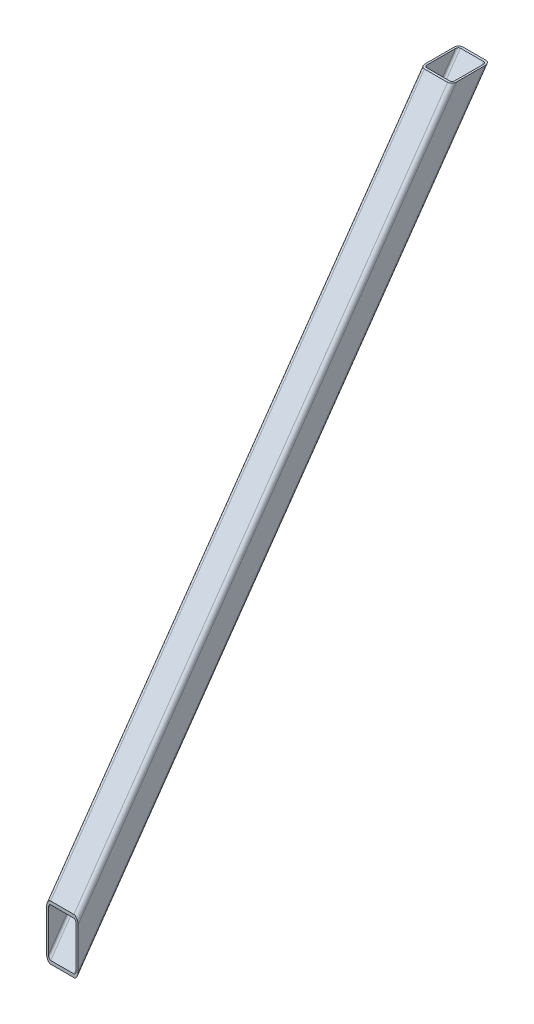
ISO-10303-21;
HEADER;
FILE_DESCRIPTION(('STEP AP214'),'2;1');
FILE_NAME('part.step','',(''),(''),'','','');
FILE_SCHEMA(('AUTOMOTIVE_DESIGN { 1 0 10303 214 1 1 1 1 }'));
ENDSEC;
DATA;
#1=APPLICATION_CONTEXT('core data for automotive mechanical design processes');
#2=APPLICATION_PROTOCOL_DEFINITION('international standard','automotive_design',2000,#1);
#3=PRODUCT_CONTEXT('',#1,'mechanical');
#4=PRODUCT('Part','Part','',(#3));
#5=PRODUCT_RELATED_PRODUCT_CATEGORY('part','',(#4));
#6=PRODUCT_DEFINITION_FORMATION('','',#4);
#7=PRODUCT_DEFINITION_CONTEXT('part definition',#1,'design');
#8=PRODUCT_DEFINITION('design','',#6,#7);
#9=PRODUCT_DEFINITION_SHAPE('','',#8);
#10=(LENGTH_UNIT() NAMED_UNIT(*) SI_UNIT(.MILLI.,.METRE.));
#11=(NAMED_UNIT(*) PLANE_ANGLE_UNIT() SI_UNIT($,.RADIAN.));
#12=(NAMED_UNIT(*) SI_UNIT($,.STERADIAN.) SOLID_ANGLE_UNIT());
#13=UNCERTAINTY_MEASURE_WITH_UNIT(LENGTH_MEASURE(1.E-05),#10,'distance_accuracy_value','');
#14=(GEOMETRIC_REPRESENTATION_CONTEXT(3) GLOBAL_UNCERTAINTY_ASSIGNED_CONTEXT((#13)) GLOBAL_UNIT_ASSIGNED_CONTEXT((#10,
#11,#12)) REPRESENTATION_CONTEXT('',''));
#15=CARTESIAN_POINT('',(0.,0.,0.));
#16=DIRECTION('',(0.,0.,1.));
#17=DIRECTION('',(1.,0.,0.));
#18=AXIS2_PLACEMENT_3D('',#15,#16,#17);
#19=CARTESIAN_POINT('',(1.11022302462516E-13,285.,-635.5));
#20=DIRECTION('',(0.,-1.,0.));
#21=DIRECTION('',(0.,0.,-1.));
#22=AXIS2_PLACEMENT_3D('',#19,#20,#21);
#23=PLANE('',#22);
#24=DIRECTION('',(0.,0.,1.));
#25=VECTOR('',#24,1.);
#26=CARTESIAN_POINT('',(22.,285.,15.1543128193461));
#27=LINE('',#26,#25);
#28=CARTESIAN_POINT('',(22.,285.,-653.883084662829));
#29=VERTEX_POINT('',#28);
#30=CARTESIAN_POINT('',(22.,285.,-608.714424878655));
#31=VERTEX_POINT('',#30);
#32=EDGE_CURVE('E185',#29,#31,#27,.T.);
#33=ORIENTED_EDGE('',*,*,#32,.T.);
#34=CARTESIAN_POINT('',(18.5,285.,-608.714424878655));
#35=DIRECTION('',(0.,-1.,0.));
#36=DIRECTION('',(0.,0.,-1.));
#37=AXIS2_PLACEMENT_3D('',#34,#35,#36);
#38=ELLIPSE('',#37,4.27271106066511,3.50000000000001);
#39=CARTESIAN_POINT('',(18.5,285.,-604.44171381799));
#40=VERTEX_POINT('',#39);
#41=EDGE_CURVE('E284',#31,#40,#38,.T.);
#42=ORIENTED_EDGE('',*,*,#41,.T.);
#43=DIRECTION('',(-1.,0.,0.));
#44=VECTOR('',#43,1.);
#45=CARTESIAN_POINT('',(18.5,285.,-604.44171381799));
#46=LINE('',#45,#44);
#47=CARTESIAN_POINT('',(-18.5,285.,-604.44171381799));
#48=VERTEX_POINT('',#47);
#49=EDGE_CURVE('E280',#40,#48,#46,.T.);
#50=ORIENTED_EDGE('',*,*,#49,.T.);
#51=CARTESIAN_POINT('',(-18.5,285.,-608.714424878655));
#52=DIRECTION('',(0.,-1.,0.));
#53=DIRECTION('',(0.,0.,-1.));
#54=AXIS2_PLACEMENT_3D('',#51,#52,#53);
#55=ELLIPSE('',#54,4.27271106066511,3.50000000000001);
#56=CARTESIAN_POINT('',(-22.,285.,-608.714424878655));
#57=VERTEX_POINT('',#56);
#58=EDGE_CURVE('E281',#48,#57,#55,.T.);
#59=ORIENTED_EDGE('',*,*,#58,.T.);
#60=DIRECTION('',(0.,0.,-1.));
#61=VECTOR('',#60,1.);
#62=CARTESIAN_POINT('',(-22.0000000000001,285.,-15.1543128193465));
#63=LINE('',#62,#61);
#64=CARTESIAN_POINT('',(-22.,285.,-653.883084662829));
#65=VERTEX_POINT('',#64);
#66=EDGE_CURVE('E187',#57,#65,#63,.T.);
#67=ORIENTED_EDGE('',*,*,#66,.T.);
#68=CARTESIAN_POINT('',(-18.5,285.,-653.883084662829));
#69=DIRECTION('',(0.,-1.,0.));
#70=DIRECTION('',(0.,0.,-1.));
#71=AXIS2_PLACEMENT_3D('',#68,#69,#70);
#72=ELLIPSE('',#71,4.27271106066511,3.50000000000001);
#73=CARTESIAN_POINT('',(-18.5,285.,-658.155795723494));
#74=VERTEX_POINT('',#73);
#75=EDGE_CURVE('E191',#65,#74,#72,.T.);
#76=ORIENTED_EDGE('',*,*,#75,.T.);
#77=DIRECTION('',(1.,0.,0.));
#78=VECTOR('',#77,1.);
#79=CARTESIAN_POINT('',(18.5,285.,-658.155795723494));
#80=LINE('',#79,#78);
#81=CARTESIAN_POINT('',(18.5,285.,-658.155795723494));
#82=VERTEX_POINT('',#81);
#83=EDGE_CURVE('E78',#74,#82,#80,.T.);
#84=ORIENTED_EDGE('',*,*,#83,.T.);
#85=CARTESIAN_POINT('',(18.5,285.,-653.883084662829));
#86=DIRECTION('',(0.,-1.,0.));
#87=DIRECTION('',(0.,0.,-1.));
#88=AXIS2_PLACEMENT_3D('',#85,#86,#87);
#89=ELLIPSE('',#88,4.27271106066511,3.50000000000001);
#90=EDGE_CURVE('E13',#82,#29,#89,.T.);
#91=ORIENTED_EDGE('',*,*,#90,.T.);
#92=EDGE_LOOP('',(#33,#42,#50,#59,#67,#76,#84,#91));
#93=FACE_BOUND('',#92,.T.);
#94=CARTESIAN_POINT('',(18.5000000000001,285.,-608.714424878655));
#95=DIRECTION('',(0.,-1.,0.));
#96=DIRECTION('',(0.,0.,-1.));
#97=AXIS2_PLACEMENT_3D('',#94,#95,#96);
#98=ELLIPSE('',#97,7.93503482694948,6.50000000000001);
#99=CARTESIAN_POINT('',(25.0000000000001,285.,-608.714424878655));
#100=VERTEX_POINT('',#99);
#101=CARTESIAN_POINT('',(18.5,285.,-600.779390051705));
#102=VERTEX_POINT('',#101);
#103=EDGE_CURVE('E260',#100,#102,#98,.T.);
#104=ORIENTED_EDGE('',*,*,#103,.F.);
#105=DIRECTION('',(0.,0.,1.));
#106=VECTOR('',#105,1.);
#107=CARTESIAN_POINT('',(25.0000000000001,285.,15.1543128193461));
#108=LINE('',#107,#106);
#109=CARTESIAN_POINT('',(25.0000000000001,285.,-653.883084662829));
#110=VERTEX_POINT('',#109);
#111=EDGE_CURVE('E203',#110,#100,#108,.T.);
#112=ORIENTED_EDGE('',*,*,#111,.F.);
#113=CARTESIAN_POINT('',(18.5000000000001,285.,-653.883084662829));
#114=DIRECTION('',(0.,-1.,0.));
#115=DIRECTION('',(0.,0.,-1.));
#116=AXIS2_PLACEMENT_3D('',#113,#114,#115);
#117=ELLIPSE('',#116,7.93503482694948,6.50000000000001);
#118=CARTESIAN_POINT('',(18.5,285.,-661.818119489778));
#119=VERTEX_POINT('',#118);
#120=EDGE_CURVE('E201',#119,#110,#117,.T.);
#121=ORIENTED_EDGE('',*,*,#120,.F.);
#122=DIRECTION('',(1.,0.,0.));
#123=VECTOR('',#122,1.);
#124=CARTESIAN_POINT('',(18.5,285.,-661.818119489778));
#125=LINE('',#124,#123);
#126=CARTESIAN_POINT('',(-18.4999999999999,285.,-661.818119489778));
#127=VERTEX_POINT('',#126);
#128=EDGE_CURVE('E197',#127,#119,#125,.T.);
#129=ORIENTED_EDGE('',*,*,#128,.F.);
#130=CARTESIAN_POINT('',(-18.5,285.,-653.883084662829));
#131=DIRECTION('',(0.,-1.,0.));
#132=DIRECTION('',(0.,0.,-1.));
#133=AXIS2_PLACEMENT_3D('',#130,#131,#132);
#134=ELLIPSE('',#133,7.93503482694948,6.50000000000001);
#135=CARTESIAN_POINT('',(-25.,285.,-653.883084662829));
#136=VERTEX_POINT('',#135);
#137=EDGE_CURVE('E195',#136,#127,#134,.T.);
#138=ORIENTED_EDGE('',*,*,#137,.F.);
#139=DIRECTION('',(0.,0.,-1.));
#140=VECTOR('',#139,1.);
#141=CARTESIAN_POINT('',(-25.,285.,-15.1543128193465));
#142=LINE('',#141,#140);
#143=CARTESIAN_POINT('',(-25.,285.,-608.714424878655));
#144=VERTEX_POINT('',#143);
#145=EDGE_CURVE('E188',#144,#136,#142,.T.);
#146=ORIENTED_EDGE('',*,*,#145,.F.);
#147=CARTESIAN_POINT('',(-18.4999999999999,285.,-608.714424878655));
#148=DIRECTION('',(0.,-1.,0.));
#149=DIRECTION('',(0.,0.,-1.));
#150=AXIS2_PLACEMENT_3D('',#147,#148,#149);
#151=ELLIPSE('',#150,7.93503482694948,6.50000000000001);
#152=CARTESIAN_POINT('',(-18.4999999999999,285.,-600.779390051705));
#153=VERTEX_POINT('',#152);
#154=EDGE_CURVE('E277',#153,#144,#151,.T.);
#155=ORIENTED_EDGE('',*,*,#154,.F.);
#156=DIRECTION('',(-1.,0.,0.));
#157=VECTOR('',#156,1.);
#158=CARTESIAN_POINT('',(18.5,285.,-600.779390051705));
#159=LINE('',#158,#157);
#160=EDGE_CURVE('E267',#102,#153,#159,.T.);
#161=ORIENTED_EDGE('',*,*,#160,.F.);
#162=EDGE_LOOP('',(#104,#112,#121,#129,#138,#146,#155,#161));
#163=FACE_BOUND('',#162,.T.);
#164=ADVANCED_FACE('F68',(#93,#163),#23,.F.);
#165=CARTESIAN_POINT('',(-25.,-627.199222357105,-15.1543128193465));
#166=DIRECTION('',(1.,0.,0.));
#167=DIRECTION('',(0.,0.,-1.));
#168=AXIS2_PLACEMENT_3D('',#165,#166,#167);
#169=PLANE('',#168);
#170=DIRECTION('',(0.,0.819152044288991,-0.573576436351047));
#171=VECTOR('',#170,1.);
#172=CARTESIAN_POINT('',(-25.,-627.199222357105,-15.1543128193465));
#173=LINE('',#172,#171);
#174=CARTESIAN_POINT('',(-25.,-640.272935963149,-6.));
#175=VERTEX_POINT('',#174);
#176=EDGE_CURVE('E87',#175,#136,#173,.T.);
#177=ORIENTED_EDGE('',*,*,#176,.F.);
#178=DIRECTION('',(0.,1.,0.));
#179=VECTOR('',#178,1.);
#180=CARTESIAN_POINT('',(-25.,-627.199222357105,-6.));
#181=LINE('',#180,#179);
#182=CARTESIAN_POINT('',(-25.,-575.765404525168,-6.));
#183=VERTEX_POINT('',#182);
#184=EDGE_CURVE('E312',#175,#183,#181,.T.);
#185=ORIENTED_EDGE('',*,*,#184,.T.);
#186=DIRECTION('',(0.,0.819152044288991,-0.573576436351047));
#187=VECTOR('',#186,1.);
#188=CARTESIAN_POINT('',(-25.,-605.976894212117,15.1543128193461));
#189=LINE('',#188,#187);
#190=EDGE_CURVE('E296',#183,#144,#189,.T.);
#191=ORIENTED_EDGE('',*,*,#190,.T.);
#192=ORIENTED_EDGE('',*,*,#145,.T.);
#193=EDGE_LOOP('',(#177,#185,#191,#192));
#194=FACE_BOUND('',#193,.T.);
#195=ADVANCED_FACE('F224',(#194),#169,.F.);
#196=CARTESIAN_POINT('',(-18.5,-627.199222357105,-15.1543128193465));
#197=DIRECTION('',(0.,0.819152044288991,-0.573576436351047));
#198=DIRECTION('',(0.,0.573576436351047,0.819152044288991));
#199=AXIS2_PLACEMENT_3D('',#196,#197,#198);
#200=CYLINDRICAL_SURFACE('',#199,6.50000000000001);
#201=DIRECTION('',(0.,0.819152044288991,-0.573576436351047));
#202=VECTOR('',#201,1.);
#203=CARTESIAN_POINT('',(-18.4999999999999,-630.927469193387,-20.478801107225));
#204=LINE('',#203,#202);
#205=CARTESIAN_POINT('',(-18.4999999999999,-651.605340134686,-6.));
#206=VERTEX_POINT('',#205);
#207=EDGE_CURVE('E200',#206,#127,#204,.T.);
#208=ORIENTED_EDGE('',*,*,#207,.F.);
#209=CARTESIAN_POINT('',(-18.5,-640.272935963149,-6.));
#210=DIRECTION('',(0.,0.,-1.));
#211=DIRECTION('',(0.,1.,0.));
#212=AXIS2_PLACEMENT_3D('',#209,#210,#211);
#213=ELLIPSE('',#212,11.3324041715371,6.50000000000001);
#214=EDGE_CURVE('E314',#206,#175,#213,.T.);
#215=ORIENTED_EDGE('',*,*,#214,.T.);
#216=ORIENTED_EDGE('',*,*,#176,.T.);
#217=ORIENTED_EDGE('',*,*,#137,.T.);
#218=EDGE_LOOP('',(#208,#215,#216,#217));
#219=FACE_BOUND('',#218,.T.);
#220=ADVANCED_FACE('F229',(#219),#200,.T.);
#221=CARTESIAN_POINT('',(18.5,-630.927469193387,-20.478801107225));
#222=DIRECTION('',(0.,0.573576436351047,0.819152044288991));
#223=DIRECTION('',(0.,-0.819152044288991,0.573576436351047));
#224=AXIS2_PLACEMENT_3D('',#221,#222,#223);
#225=PLANE('',#224);
#226=DIRECTION('',(0.,0.819152044288991,-0.573576436351047));
#227=VECTOR('',#226,1.);
#228=CARTESIAN_POINT('',(18.5,-630.927469193387,-20.478801107225));
#229=LINE('',#228,#227);
#230=CARTESIAN_POINT('',(18.5,-651.605340134686,-6.));
#231=VERTEX_POINT('',#230);
#232=EDGE_CURVE('E100',#231,#119,#229,.T.);
#233=ORIENTED_EDGE('',*,*,#232,.F.);
#234=DIRECTION('',(-1.,0.,0.));
#235=VECTOR('',#234,1.);
#236=CARTESIAN_POINT('',(18.5,-651.605340134686,-6.));
#237=LINE('',#236,#235);
#238=EDGE_CURVE('E316',#231,#206,#237,.T.);
#239=ORIENTED_EDGE('',*,*,#238,.T.);
#240=ORIENTED_EDGE('',*,*,#207,.T.);
#241=ORIENTED_EDGE('',*,*,#128,.T.);
#242=EDGE_LOOP('',(#233,#239,#240,#241));
#243=FACE_BOUND('',#242,.T.);
#244=ADVANCED_FACE('F236',(#243),#225,.F.);
#245=CARTESIAN_POINT('',(18.5000000000001,-627.199222357105,-15.1543128193465));
#246=DIRECTION('',(0.,0.819152044288991,-0.573576436351047));
#247=DIRECTION('',(0.,0.573576436351047,0.819152044288991));
#248=AXIS2_PLACEMENT_3D('',#245,#246,#247);
#249=CYLINDRICAL_SURFACE('',#248,6.50000000000001);
#250=DIRECTION('',(0.,0.819152044288991,-0.573576436351047));
#251=VECTOR('',#250,1.);
#252=CARTESIAN_POINT('',(25.0000000000001,-627.199222357105,-15.1543128193465));
#253=LINE('',#252,#251);
#254=CARTESIAN_POINT('',(25.0000000000001,-640.272935963149,-6.));
#255=VERTEX_POINT('',#254);
#256=EDGE_CURVE('E108',#255,#110,#253,.T.);
#257=ORIENTED_EDGE('',*,*,#256,.F.);
#258=CARTESIAN_POINT('',(18.5000000000001,-640.272935963149,-6.));
#259=DIRECTION('',(0.,0.,-1.));
#260=DIRECTION('',(0.,1.,0.));
#261=AXIS2_PLACEMENT_3D('',#258,#259,#260);
#262=ELLIPSE('',#261,11.3324041715371,6.50000000000001);
#263=EDGE_CURVE('E319',#255,#231,#262,.T.);
#264=ORIENTED_EDGE('',*,*,#263,.T.);
#265=ORIENTED_EDGE('',*,*,#232,.T.);
#266=ORIENTED_EDGE('',*,*,#120,.T.);
#267=EDGE_LOOP('',(#257,#264,#265,#266));
#268=FACE_BOUND('',#267,.T.);
#269=ADVANCED_FACE('F239',(#268),#249,.T.);
#270=CARTESIAN_POINT('',(25.0000000000001,-605.976894212117,15.1543128193461));
#271=DIRECTION('',(-1.,0.,0.));
#272=DIRECTION('',(0.,0.,1.));
#273=AXIS2_PLACEMENT_3D('',#270,#271,#272);
#274=PLANE('',#273);
#275=ORIENTED_EDGE('',*,*,#111,.T.);
#276=DIRECTION('',(0.,0.819152044288991,-0.573576436351047));
#277=VECTOR('',#276,1.);
#278=CARTESIAN_POINT('',(25.0000000000001,-605.976894212117,15.1543128193461));
#279=LINE('',#278,#277);
#280=CARTESIAN_POINT('',(25.0000000000001,-575.765404525168,-6.));
#281=VERTEX_POINT('',#280);
#282=EDGE_CURVE('E250',#281,#100,#279,.T.);
#283=ORIENTED_EDGE('',*,*,#282,.F.);
#284=DIRECTION('',(0.,-1.,0.));
#285=VECTOR('',#284,1.);
#286=CARTESIAN_POINT('',(25.0000000000001,-605.976894212117,-6.));
#287=LINE('',#286,#285);
#288=EDGE_CURVE('E181',#281,#255,#287,.T.);
#289=ORIENTED_EDGE('',*,*,#288,.T.);
#290=ORIENTED_EDGE('',*,*,#256,.T.);
#291=EDGE_LOOP('',(#275,#283,#289,#290));
#292=FACE_BOUND('',#291,.T.);
#293=ADVANCED_FACE('F221',(#292),#274,.F.);
#294=CARTESIAN_POINT('',(22.,-605.976894212117,15.1543128193461));
#295=DIRECTION('',(-1.,0.,0.));
#296=DIRECTION('',(0.,0.,1.));
#297=AXIS2_PLACEMENT_3D('',#294,#295,#296);
#298=PLANE('',#297);
#299=DIRECTION('',(0.,0.819152044288991,-0.573576436351047));
#300=VECTOR('',#299,1.);
#301=CARTESIAN_POINT('',(22.,-627.199222357105,-15.1543128193465));
#302=LINE('',#301,#300);
#303=CARTESIAN_POINT('',(22.,-640.272935963149,-6.));
#304=VERTEX_POINT('',#303);
#305=EDGE_CURVE('E117',#304,#29,#302,.T.);
#306=ORIENTED_EDGE('',*,*,#305,.F.);
#307=DIRECTION('',(0.,-1.,0.));
#308=VECTOR('',#307,1.);
#309=CARTESIAN_POINT('',(22.,-605.976894212117,-6.));
#310=LINE('',#309,#308);
#311=CARTESIAN_POINT('',(22.,-575.765404525168,-6.));
#312=VERTEX_POINT('',#311);
#313=EDGE_CURVE('E322',#312,#304,#310,.T.);
#314=ORIENTED_EDGE('',*,*,#313,.F.);
#315=DIRECTION('',(0.,0.819152044288991,-0.573576436351047));
#316=VECTOR('',#315,1.);
#317=CARTESIAN_POINT('',(22.,-605.976894212117,15.1543128193461));
#318=LINE('',#317,#316);
#319=EDGE_CURVE('E300',#312,#31,#318,.T.);
#320=ORIENTED_EDGE('',*,*,#319,.T.);
#321=ORIENTED_EDGE('',*,*,#32,.F.);
#322=EDGE_LOOP('',(#306,#314,#320,#321));
#323=FACE_BOUND('',#322,.T.);
#324=ADVANCED_FACE('F214',(#323),#298,.T.);
#325=CARTESIAN_POINT('',(18.5,-627.199222357105,-15.1543128193465));
#326=DIRECTION('',(0.,0.819152044288991,-0.573576436351047));
#327=DIRECTION('',(0.,0.573576436351047,0.819152044288991));
#328=AXIS2_PLACEMENT_3D('',#325,#326,#327);
#329=CYLINDRICAL_SURFACE('',#328,3.50000000000001);
#330=DIRECTION('',(0.,0.819152044288991,-0.573576436351047));
#331=VECTOR('',#330,1.);
#332=CARTESIAN_POINT('',(18.5,-629.206739884334,-18.021344974358));
#333=LINE('',#332,#331);
#334=CARTESIAN_POINT('',(18.5,-646.374999747823,-6.));
#335=VERTEX_POINT('',#334);
#336=EDGE_CURVE('E162',#335,#82,#333,.T.);
#337=ORIENTED_EDGE('',*,*,#336,.F.);
#338=CARTESIAN_POINT('',(18.5,-640.272935963149,-6.));
#339=DIRECTION('',(0.,0.,-1.));
#340=DIRECTION('',(0.,1.,0.));
#341=AXIS2_PLACEMENT_3D('',#338,#339,#340);
#342=ELLIPSE('',#341,6.10206378467385,3.50000000000001);
#343=EDGE_CURVE('E176',#304,#335,#342,.T.);
#344=ORIENTED_EDGE('',*,*,#343,.F.);
#345=ORIENTED_EDGE('',*,*,#305,.T.);
#346=ORIENTED_EDGE('',*,*,#90,.F.);
#347=EDGE_LOOP('',(#337,#344,#345,#346));
#348=FACE_BOUND('',#347,.T.);
#349=ADVANCED_FACE('F212',(#348),#329,.F.);
#350=CARTESIAN_POINT('',(18.5,-629.206739884334,-18.021344974358));
#351=DIRECTION('',(0.,0.573576436351047,0.819152044288991));
#352=DIRECTION('',(0.,-0.819152044288991,0.573576436351047));
#353=AXIS2_PLACEMENT_3D('',#350,#351,#352);
#354=PLANE('',#353);
#355=DIRECTION('',(0.,0.819152044288991,-0.573576436351047));
#356=VECTOR('',#355,1.);
#357=CARTESIAN_POINT('',(-18.5,-629.206739884334,-18.021344974358));
#358=LINE('',#357,#356);
#359=CARTESIAN_POINT('',(-18.5,-646.374999747823,-6.));
#360=VERTEX_POINT('',#359);
#361=EDGE_CURVE('E129',#360,#74,#358,.T.);
#362=ORIENTED_EDGE('',*,*,#361,.F.);
#363=DIRECTION('',(-1.,0.,0.));
#364=VECTOR('',#363,1.);
#365=CARTESIAN_POINT('',(18.5,-646.374999747823,-6.));
#366=LINE('',#365,#364);
#367=EDGE_CURVE('E169',#335,#360,#366,.T.);
#368=ORIENTED_EDGE('',*,*,#367,.F.);
#369=ORIENTED_EDGE('',*,*,#336,.T.);
#370=ORIENTED_EDGE('',*,*,#83,.F.);
#371=EDGE_LOOP('',(#362,#368,#369,#370));
#372=FACE_BOUND('',#371,.T.);
#373=ADVANCED_FACE('F168',(#372),#354,.T.);
#374=CARTESIAN_POINT('',(-18.5,-627.199222357105,-15.1543128193465));
#375=DIRECTION('',(0.,0.819152044288991,-0.573576436351047));
#376=DIRECTION('',(0.,0.573576436351047,0.819152044288991));
#377=AXIS2_PLACEMENT_3D('',#374,#375,#376);
#378=CYLINDRICAL_SURFACE('',#377,3.50000000000001);
#379=DIRECTION('',(0.,0.819152044288991,-0.573576436351047));
#380=VECTOR('',#379,1.);
#381=CARTESIAN_POINT('',(-22.,-627.199222357105,-15.1543128193465));
#382=LINE('',#381,#380);
#383=CARTESIAN_POINT('',(-22.,-640.272935963149,-6.));
#384=VERTEX_POINT('',#383);
#385=EDGE_CURVE('E72',#384,#65,#382,.T.);
#386=ORIENTED_EDGE('',*,*,#385,.F.);
#387=CARTESIAN_POINT('',(-18.5,-640.272935963149,-6.));
#388=DIRECTION('',(0.,0.,-1.));
#389=DIRECTION('',(0.,1.,0.));
#390=AXIS2_PLACEMENT_3D('',#387,#388,#389);
#391=ELLIPSE('',#390,6.10206378467385,3.50000000000001);
#392=EDGE_CURVE('E175',#360,#384,#391,.T.);
#393=ORIENTED_EDGE('',*,*,#392,.F.);
#394=ORIENTED_EDGE('',*,*,#361,.T.);
#395=ORIENTED_EDGE('',*,*,#75,.F.);
#396=EDGE_LOOP('',(#386,#393,#394,#395));
#397=FACE_BOUND('',#396,.T.);
#398=ADVANCED_FACE('F178',(#397),#378,.F.);
#399=CARTESIAN_POINT('',(-22.,-627.199222357105,-15.1543128193465));
#400=DIRECTION('',(1.,0.,0.));
#401=DIRECTION('',(0.,0.,-1.));
#402=AXIS2_PLACEMENT_3D('',#399,#400,#401);
#403=PLANE('',#402);
#404=ORIENTED_EDGE('',*,*,#66,.F.);
#405=DIRECTION('',(0.,0.819152044288991,-0.573576436351047));
#406=VECTOR('',#405,1.);
#407=CARTESIAN_POINT('',(-22.,-605.976894212117,15.1543128193461));
#408=LINE('',#407,#406);
#409=CARTESIAN_POINT('',(-22.,-575.765404525168,-6.));
#410=VERTEX_POINT('',#409);
#411=EDGE_CURVE('E301',#410,#57,#408,.T.);
#412=ORIENTED_EDGE('',*,*,#411,.F.);
#413=DIRECTION('',(0.,1.,0.));
#414=VECTOR('',#413,1.);
#415=CARTESIAN_POINT('',(-22.,-627.199222357105,-6.));
#416=LINE('',#415,#414);
#417=EDGE_CURVE('E179',#384,#410,#416,.T.);
#418=ORIENTED_EDGE('',*,*,#417,.F.);
#419=ORIENTED_EDGE('',*,*,#385,.T.);
#420=EDGE_LOOP('',(#404,#412,#418,#419));
#421=FACE_BOUND('',#420,.T.);
#422=ADVANCED_FACE('F70',(#421),#403,.T.);
#423=CARTESIAN_POINT('',(0.,-616.588058284611,-6.));
#424=DIRECTION('',(0.,0.,-1.));
#425=DIRECTION('',(-1.,0.,0.));
#426=AXIS2_PLACEMENT_3D('',#423,#424,#425);
#427=PLANE('',#426);
#428=CARTESIAN_POINT('',(-18.4999999999999,-575.765404525168,-6.));
#429=DIRECTION('',(0.,0.,-1.));
#430=DIRECTION('',(0.,1.,0.));
#431=AXIS2_PLACEMENT_3D('',#428,#429,#430);
#432=ELLIPSE('',#431,11.3324041715371,6.50000000000001);
#433=CARTESIAN_POINT('',(-18.4999999999999,-564.433000353631,-6.));
#434=VERTEX_POINT('',#433);
#435=EDGE_CURVE('E268',#183,#434,#432,.T.);
#436=ORIENTED_EDGE('',*,*,#435,.F.);
#437=ORIENTED_EDGE('',*,*,#184,.F.);
#438=ORIENTED_EDGE('',*,*,#214,.F.);
#439=ORIENTED_EDGE('',*,*,#238,.F.);
#440=ORIENTED_EDGE('',*,*,#263,.F.);
#441=ORIENTED_EDGE('',*,*,#288,.F.);
#442=CARTESIAN_POINT('',(18.5000000000001,-575.765404525168,-6.));
#443=DIRECTION('',(0.,0.,-1.));
#444=DIRECTION('',(0.,1.,0.));
#445=AXIS2_PLACEMENT_3D('',#442,#443,#444);
#446=ELLIPSE('',#445,11.3324041715371,6.50000000000001);
#447=CARTESIAN_POINT('',(18.5,-564.433000353631,-6.));
#448=VERTEX_POINT('',#447);
#449=EDGE_CURVE('E262',#448,#281,#446,.T.);
#450=ORIENTED_EDGE('',*,*,#449,.F.);
#451=DIRECTION('',(1.,0.,0.));
#452=VECTOR('',#451,1.);
#453=CARTESIAN_POINT('',(18.5,-564.433000353631,-6.));
#454=LINE('',#453,#452);
#455=EDGE_CURVE('E294',#434,#448,#454,.T.);
#456=ORIENTED_EDGE('',*,*,#455,.F.);
#457=EDGE_LOOP('',(#436,#437,#438,#439,#440,#441,#450,#456));
#458=FACE_BOUND('',#457,.T.);
#459=ORIENTED_EDGE('',*,*,#392,.T.);
#460=ORIENTED_EDGE('',*,*,#417,.T.);
#461=CARTESIAN_POINT('',(-18.5,-575.765404525168,-6.));
#462=DIRECTION('',(0.,0.,-1.));
#463=DIRECTION('',(0.,1.,0.));
#464=AXIS2_PLACEMENT_3D('',#461,#462,#463);
#465=ELLIPSE('',#464,6.10206378467385,3.50000000000001);
#466=CARTESIAN_POINT('',(-18.5,-569.663340740495,-6.));
#467=VERTEX_POINT('',#466);
#468=EDGE_CURVE('E287',#410,#467,#465,.T.);
#469=ORIENTED_EDGE('',*,*,#468,.T.);
#470=DIRECTION('',(1.,0.,0.));
#471=VECTOR('',#470,1.);
#472=CARTESIAN_POINT('',(18.5,-569.663340740495,-6.));
#473=LINE('',#472,#471);
#474=CARTESIAN_POINT('',(18.5,-569.663340740495,-6.));
#475=VERTEX_POINT('',#474);
#476=EDGE_CURVE('E324',#467,#475,#473,.T.);
#477=ORIENTED_EDGE('',*,*,#476,.T.);
#478=CARTESIAN_POINT('',(18.5,-575.765404525168,-6.));
#479=DIRECTION('',(0.,0.,-1.));
#480=DIRECTION('',(0.,1.,0.));
#481=AXIS2_PLACEMENT_3D('',#478,#479,#480);
#482=ELLIPSE('',#481,6.10206378467385,3.50000000000001);
#483=EDGE_CURVE('E275',#475,#312,#482,.T.);
#484=ORIENTED_EDGE('',*,*,#483,.T.);
#485=ORIENTED_EDGE('',*,*,#313,.T.);
#486=ORIENTED_EDGE('',*,*,#343,.T.);
#487=ORIENTED_EDGE('',*,*,#367,.T.);
#488=EDGE_LOOP('',(#459,#460,#469,#477,#484,#485,#486,#487));
#489=FACE_BOUND('',#488,.T.);
#490=ADVANCED_FACE('F173',(#458,#489),#427,.F.);
#491=CARTESIAN_POINT('',(18.5,-605.976894212117,15.1543128193461));
#492=DIRECTION('',(0.,0.819152044288991,-0.573576436351047));
#493=DIRECTION('',(0.,0.573576436351047,0.819152044288991));
#494=AXIS2_PLACEMENT_3D('',#491,#492,#493);
#495=CYLINDRICAL_SURFACE('',#494,3.50000000000001);
#496=ORIENTED_EDGE('',*,*,#483,.F.);
#497=DIRECTION('',(0.,0.819152044288991,-0.573576436351047));
#498=VECTOR('',#497,1.);
#499=CARTESIAN_POINT('',(18.5,-603.969376684888,18.0213449743576));
#500=LINE('',#499,#498);
#501=EDGE_CURVE('E299',#475,#40,#500,.T.);
#502=ORIENTED_EDGE('',*,*,#501,.T.);
#503=ORIENTED_EDGE('',*,*,#41,.F.);
#504=ORIENTED_EDGE('',*,*,#319,.F.);
#505=EDGE_LOOP('',(#496,#502,#503,#504));
#506=FACE_BOUND('',#505,.T.);
#507=ADVANCED_FACE('F361',(#506),#495,.F.);
#508=CARTESIAN_POINT('',(18.5,-603.969376684888,18.0213449743576));
#509=DIRECTION('',(0.,-0.573576436351047,-0.819152044288991));
#510=DIRECTION('',(0.,0.819152044288991,-0.573576436351047));
#511=AXIS2_PLACEMENT_3D('',#508,#509,#510);
#512=PLANE('',#511);
#513=ORIENTED_EDGE('',*,*,#476,.F.);
#514=DIRECTION('',(0.,0.819152044288991,-0.573576436351047));
#515=VECTOR('',#514,1.);
#516=CARTESIAN_POINT('',(-18.5,-603.969376684888,18.0213449743576));
#517=LINE('',#516,#515);
#518=EDGE_CURVE('E304',#467,#48,#517,.T.);
#519=ORIENTED_EDGE('',*,*,#518,.T.);
#520=ORIENTED_EDGE('',*,*,#49,.F.);
#521=ORIENTED_EDGE('',*,*,#501,.F.);
#522=EDGE_LOOP('',(#513,#519,#520,#521));
#523=FACE_BOUND('',#522,.T.);
#524=ADVANCED_FACE('F369',(#523),#512,.T.);
#525=CARTESIAN_POINT('',(-18.5,-605.976894212117,15.1543128193461));
#526=DIRECTION('',(0.,0.819152044288991,-0.573576436351047));
#527=DIRECTION('',(0.,0.573576436351047,0.819152044288991));
#528=AXIS2_PLACEMENT_3D('',#525,#526,#527);
#529=CYLINDRICAL_SURFACE('',#528,3.50000000000001);
#530=ORIENTED_EDGE('',*,*,#468,.F.);
#531=ORIENTED_EDGE('',*,*,#411,.T.);
#532=ORIENTED_EDGE('',*,*,#58,.F.);
#533=ORIENTED_EDGE('',*,*,#518,.F.);
#534=EDGE_LOOP('',(#530,#531,#532,#533));
#535=FACE_BOUND('',#534,.T.);
#536=ADVANCED_FACE('F374',(#535),#529,.F.);
#537=CARTESIAN_POINT('',(18.5,-602.248647375835,20.4788011072246));
#538=DIRECTION('',(0.,-0.573576436351047,-0.819152044288991));
#539=DIRECTION('',(0.,0.819152044288991,-0.573576436351047));
#540=AXIS2_PLACEMENT_3D('',#537,#538,#539);
#541=PLANE('',#540);
#542=DIRECTION('',(0.,0.819152044288991,-0.573576436351047));
#543=VECTOR('',#542,1.);
#544=CARTESIAN_POINT('',(-18.4999999999999,-602.248647375835,20.4788011072246));
#545=LINE('',#544,#543);
#546=EDGE_CURVE('E271',#434,#153,#545,.T.);
#547=ORIENTED_EDGE('',*,*,#546,.F.);
#548=ORIENTED_EDGE('',*,*,#455,.T.);
#549=DIRECTION('',(0.,0.819152044288991,-0.573576436351047));
#550=VECTOR('',#549,1.);
#551=CARTESIAN_POINT('',(18.5,-602.248647375835,20.4788011072246));
#552=LINE('',#551,#550);
#553=EDGE_CURVE('E292',#448,#102,#552,.T.);
#554=ORIENTED_EDGE('',*,*,#553,.T.);
#555=ORIENTED_EDGE('',*,*,#160,.T.);
#556=EDGE_LOOP('',(#547,#548,#554,#555));
#557=FACE_BOUND('',#556,.T.);
#558=ADVANCED_FACE('F340',(#557),#541,.F.);
#559=CARTESIAN_POINT('',(18.5000000000001,-605.976894212117,15.1543128193461));
#560=DIRECTION('',(0.,0.819152044288991,-0.573576436351047));
#561=DIRECTION('',(0.,0.573576436351047,0.819152044288991));
#562=AXIS2_PLACEMENT_3D('',#559,#560,#561);
#563=CYLINDRICAL_SURFACE('',#562,6.50000000000001);
#564=ORIENTED_EDGE('',*,*,#553,.F.);
#565=ORIENTED_EDGE('',*,*,#449,.T.);
#566=ORIENTED_EDGE('',*,*,#282,.T.);
#567=ORIENTED_EDGE('',*,*,#103,.T.);
#568=EDGE_LOOP('',(#564,#565,#566,#567));
#569=FACE_BOUND('',#568,.T.);
#570=ADVANCED_FACE('F259',(#569),#563,.T.);
#571=CARTESIAN_POINT('',(-18.4999999999999,-605.976894212117,15.1543128193461));
#572=DIRECTION('',(0.,0.819152044288991,-0.573576436351047));
#573=DIRECTION('',(0.,0.573576436351047,0.819152044288991));
#574=AXIS2_PLACEMENT_3D('',#571,#572,#573);
#575=CYLINDRICAL_SURFACE('',#574,6.50000000000001);
#576=ORIENTED_EDGE('',*,*,#190,.F.);
#577=ORIENTED_EDGE('',*,*,#435,.T.);
#578=ORIENTED_EDGE('',*,*,#546,.T.);
#579=ORIENTED_EDGE('',*,*,#154,.T.);
#580=EDGE_LOOP('',(#576,#577,#578,#579));
#581=FACE_BOUND('',#580,.T.);
#582=ADVANCED_FACE('F382',(#581),#575,.T.);
#583=CLOSED_SHELL('',(#164,#195,#220,#244,#269,#293,#324,#349,#373,#398,#422,#490,#507,#524,
#536,#558,#570,#582));
#584=MANIFOLD_SOLID_BREP('B2',#583);
#585=ADVANCED_BREP_SHAPE_REPRESENTATION('',(#18,#584),#14);
#586=SHAPE_DEFINITION_REPRESENTATION(#9,#585);
ENDSEC;
END-ISO-10303-21;
